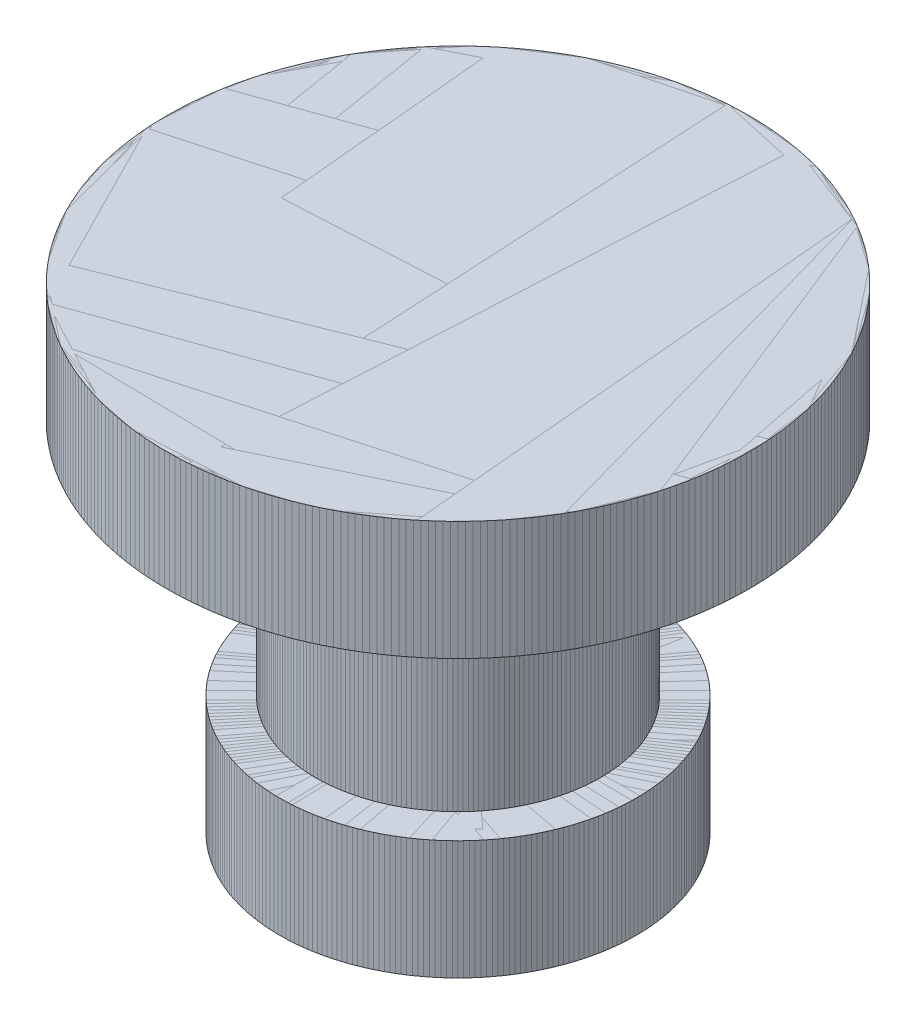
ISO-10303-21;
HEADER;
FILE_DESCRIPTION(('STEP AP214'),'2;1');
FILE_NAME('part.step','',(''),(''),'','','');
FILE_SCHEMA(('AUTOMOTIVE_DESIGN { 1 0 10303 214 1 1 1 1 }'));
ENDSEC;
DATA;
#1=APPLICATION_CONTEXT('core data for automotive mechanical design processes');
#2=APPLICATION_PROTOCOL_DEFINITION('international standard','automotive_design',2000,#1);
#3=PRODUCT_CONTEXT('',#1,'mechanical');
#4=PRODUCT('Part','Part','',(#3));
#5=PRODUCT_RELATED_PRODUCT_CATEGORY('part','',(#4));
#6=PRODUCT_DEFINITION_FORMATION('','',#4);
#7=PRODUCT_DEFINITION_CONTEXT('part definition',#1,'design');
#8=PRODUCT_DEFINITION('design','',#6,#7);
#9=PRODUCT_DEFINITION_SHAPE('','',#8);
#10=(LENGTH_UNIT() NAMED_UNIT(*) SI_UNIT(.MILLI.,.METRE.));
#11=(NAMED_UNIT(*) PLANE_ANGLE_UNIT() SI_UNIT($,.RADIAN.));
#12=(NAMED_UNIT(*) SI_UNIT($,.STERADIAN.) SOLID_ANGLE_UNIT());
#13=UNCERTAINTY_MEASURE_WITH_UNIT(LENGTH_MEASURE(1.E-05),#10,'distance_accuracy_value','');
#14=(GEOMETRIC_REPRESENTATION_CONTEXT(3) GLOBAL_UNCERTAINTY_ASSIGNED_CONTEXT((#13)) GLOBAL_UNIT_ASSIGNED_CONTEXT((#10,
#11,#12)) REPRESENTATION_CONTEXT('',''));
#15=CARTESIAN_POINT('',(0.,0.,0.));
#16=DIRECTION('',(0.,0.,1.));
#17=DIRECTION('',(1.,0.,0.));
#18=AXIS2_PLACEMENT_3D('',#15,#16,#17);
#19=CARTESIAN_POINT('',(0.,0.,0.));
#20=DIRECTION('',(0.,1.,0.));
#21=DIRECTION('',(1.,0.,0.));
#22=AXIS2_PLACEMENT_3D('',#19,#20,#21);
#23=PLANE('',#22);
#24=CARTESIAN_POINT('',(0.,0.,0.));
#25=DIRECTION('',(0.,-1.,0.));
#26=DIRECTION('',(-1.,0.,0.));
#27=AXIS2_PLACEMENT_3D('',#24,#25,#26);
#28=CIRCLE('',#27,6.223);
#29=CARTESIAN_POINT('',(-6.223,0.,0.));
#30=VERTEX_POINT('',#29);
#31=EDGE_CURVE('E11',#30,#30,#28,.T.);
#32=ORIENTED_EDGE('',*,*,#31,.F.);
#33=EDGE_LOOP('',(#32));
#34=FACE_BOUND('',#33,.T.);
#35=ADVANCED_FACE('F40',(#34),#23,.T.);
#36=CARTESIAN_POINT('',(0.,-10.16,0.));
#37=DIRECTION('',(0.,-1.,0.));
#38=DIRECTION('',(-1.,0.,0.));
#39=AXIS2_PLACEMENT_3D('',#36,#37,#38);
#40=CYLINDRICAL_SURFACE('',#39,6.223);
#41=ORIENTED_EDGE('',*,*,#31,.T.);
#42=EDGE_LOOP('',(#41));
#43=FACE_BOUND('',#42,.T.);
#44=CARTESIAN_POINT('',(0.,-2.54,0.));
#45=DIRECTION('',(0.,-1.,0.));
#46=DIRECTION('',(-1.,0.,0.));
#47=AXIS2_PLACEMENT_3D('',#44,#45,#46);
#48=CIRCLE('',#47,6.223);
#49=CARTESIAN_POINT('',(-6.223,-2.54,0.));
#50=VERTEX_POINT('',#49);
#51=EDGE_CURVE('E46',#50,#50,#48,.T.);
#52=ORIENTED_EDGE('',*,*,#51,.F.);
#53=EDGE_LOOP('',(#52));
#54=FACE_BOUND('',#53,.T.);
#55=ADVANCED_FACE('F82',(#43,#54),#40,.T.);
#56=CARTESIAN_POINT('',(0.,-2.54,-6.223));
#57=DIRECTION('',(0.,-1.,0.));
#58=DIRECTION('',(-1.,0.,0.));
#59=AXIS2_PLACEMENT_3D('',#56,#57,#58);
#60=PLANE('',#59);
#61=ORIENTED_EDGE('',*,*,#51,.T.);
#62=EDGE_LOOP('',(#61));
#63=FACE_BOUND('',#62,.T.);
#64=CARTESIAN_POINT('',(0.,-2.54,0.));
#65=DIRECTION('',(0.,-1.,0.));
#66=DIRECTION('',(-1.,0.,0.));
#67=AXIS2_PLACEMENT_3D('',#64,#65,#66);
#68=CIRCLE('',#67,3.048);
#69=CARTESIAN_POINT('',(-3.048,-2.54,0.));
#70=VERTEX_POINT('',#69);
#71=EDGE_CURVE('E50',#70,#70,#68,.T.);
#72=ORIENTED_EDGE('',*,*,#71,.F.);
#73=EDGE_LOOP('',(#72));
#74=FACE_BOUND('',#73,.T.);
#75=ADVANCED_FACE('F87',(#63,#74),#60,.T.);
#76=CARTESIAN_POINT('',(0.,-10.16,0.));
#77=DIRECTION('',(0.,-1.,0.));
#78=DIRECTION('',(-1.,0.,0.));
#79=AXIS2_PLACEMENT_3D('',#76,#77,#78);
#80=CYLINDRICAL_SURFACE('',#79,3.048);
#81=ORIENTED_EDGE('',*,*,#71,.T.);
#82=EDGE_LOOP('',(#81));
#83=FACE_BOUND('',#82,.T.);
#84=CARTESIAN_POINT('',(0.,-7.62,0.));
#85=DIRECTION('',(0.,-1.,0.));
#86=DIRECTION('',(-1.,0.,0.));
#87=AXIS2_PLACEMENT_3D('',#84,#85,#86);
#88=CIRCLE('',#87,3.048);
#89=CARTESIAN_POINT('',(-3.048,-7.62,0.));
#90=VERTEX_POINT('',#89);
#91=EDGE_CURVE('E54',#90,#90,#88,.T.);
#92=ORIENTED_EDGE('',*,*,#91,.F.);
#93=EDGE_LOOP('',(#92));
#94=FACE_BOUND('',#93,.T.);
#95=ADVANCED_FACE('F78',(#83,#94),#80,.T.);
#96=CARTESIAN_POINT('',(0.,-7.62,-3.048));
#97=DIRECTION('',(0.,1.,0.));
#98=DIRECTION('',(1.,0.,0.));
#99=AXIS2_PLACEMENT_3D('',#96,#97,#98);
#100=PLANE('',#99);
#101=ORIENTED_EDGE('',*,*,#91,.T.);
#102=EDGE_LOOP('',(#101));
#103=FACE_BOUND('',#102,.T.);
#104=CARTESIAN_POINT('',(0.,-7.62,0.));
#105=DIRECTION('',(0.,-1.,0.));
#106=DIRECTION('',(-1.,0.,0.));
#107=AXIS2_PLACEMENT_3D('',#104,#105,#106);
#108=CIRCLE('',#107,3.81);
#109=CARTESIAN_POINT('',(-3.81,-7.62,0.));
#110=VERTEX_POINT('',#109);
#111=EDGE_CURVE('E59',#110,#110,#108,.T.);
#112=ORIENTED_EDGE('',*,*,#111,.F.);
#113=EDGE_LOOP('',(#112));
#114=FACE_BOUND('',#113,.T.);
#115=ADVANCED_FACE('F70',(#103,#114),#100,.T.);
#116=CARTESIAN_POINT('',(0.,-10.16,0.));
#117=DIRECTION('',(0.,-1.,0.));
#118=DIRECTION('',(-1.,0.,0.));
#119=AXIS2_PLACEMENT_3D('',#116,#117,#118);
#120=CYLINDRICAL_SURFACE('',#119,3.81);
#121=ORIENTED_EDGE('',*,*,#111,.T.);
#122=EDGE_LOOP('',(#121));
#123=FACE_BOUND('',#122,.T.);
#124=CARTESIAN_POINT('',(0.,-10.16,0.));
#125=DIRECTION('',(0.,-1.,0.));
#126=DIRECTION('',(-1.,0.,0.));
#127=AXIS2_PLACEMENT_3D('',#124,#125,#126);
#128=CIRCLE('',#127,3.81);
#129=CARTESIAN_POINT('',(-3.81,-10.16,0.));
#130=VERTEX_POINT('',#129);
#131=EDGE_CURVE('E62',#130,#130,#128,.T.);
#132=ORIENTED_EDGE('',*,*,#131,.F.);
#133=EDGE_LOOP('',(#132));
#134=FACE_BOUND('',#133,.T.);
#135=ADVANCED_FACE('F68',(#123,#134),#120,.T.);
#136=CARTESIAN_POINT('',(0.,-10.16,-3.81));
#137=DIRECTION('',(0.,-1.,0.));
#138=DIRECTION('',(-1.,0.,0.));
#139=AXIS2_PLACEMENT_3D('',#136,#137,#138);
#140=PLANE('',#139);
#141=ORIENTED_EDGE('',*,*,#131,.T.);
#142=EDGE_LOOP('',(#141));
#143=FACE_BOUND('',#142,.T.);
#144=ADVANCED_FACE('F66',(#143),#140,.T.);
#145=CLOSED_SHELL('',(#35,#55,#75,#95,#115,#135,#144));
#146=MANIFOLD_SOLID_BREP('B2',#145);
#147=CARTESIAN_POINT('',(0.,0.,0.));
#148=DIRECTION('',(0.,1.,0.));
#149=DIRECTION('',(0.,0.,-1.));
#150=AXIS2_PLACEMENT_3D('',#147,#148,#149);
#151=PLANE('',#150);
#152=CARTESIAN_POINT('',(0.,0.,0.));
#153=DIRECTION('',(0.,-1.,0.));
#154=DIRECTION('',(0.,0.,1.));
#155=AXIS2_PLACEMENT_3D('',#152,#153,#154);
#156=CIRCLE('',#155,6.223);
#157=CARTESIAN_POINT('',(0.,0.,6.223));
#158=VERTEX_POINT('',#157);
#159=EDGE_CURVE('E39',#158,#158,#156,.T.);
#160=ORIENTED_EDGE('',*,*,#159,.F.);
#161=EDGE_LOOP('',(#160));
#162=FACE_BOUND('',#161,.T.);
#163=ADVANCED_FACE('F149',(#162),#151,.T.);
#164=CARTESIAN_POINT('',(0.,-10.16,0.));
#165=DIRECTION('',(0.,-1.,0.));
#166=DIRECTION('',(0.,0.,1.));
#167=AXIS2_PLACEMENT_3D('',#164,#165,#166);
#168=CYLINDRICAL_SURFACE('',#167,6.223);
#169=ORIENTED_EDGE('',*,*,#159,.T.);
#170=EDGE_LOOP('',(#169));
#171=FACE_BOUND('',#170,.T.);
#172=CARTESIAN_POINT('',(0.,-2.54,0.));
#173=DIRECTION('',(0.,-1.,0.));
#174=DIRECTION('',(0.,0.,1.));
#175=AXIS2_PLACEMENT_3D('',#172,#173,#174);
#176=CIRCLE('',#175,6.223);
#177=CARTESIAN_POINT('',(0.,-2.54,6.223));
#178=VERTEX_POINT('',#177);
#179=EDGE_CURVE('E155',#178,#178,#176,.T.);
#180=ORIENTED_EDGE('',*,*,#179,.F.);
#181=EDGE_LOOP('',(#180));
#182=FACE_BOUND('',#181,.T.);
#183=ADVANCED_FACE('F191',(#171,#182),#168,.T.);
#184=CARTESIAN_POINT('',(-6.223,-2.54,0.));
#185=DIRECTION('',(0.,-1.,0.));
#186=DIRECTION('',(0.,0.,1.));
#187=AXIS2_PLACEMENT_3D('',#184,#185,#186);
#188=PLANE('',#187);
#189=ORIENTED_EDGE('',*,*,#179,.T.);
#190=EDGE_LOOP('',(#189));
#191=FACE_BOUND('',#190,.T.);
#192=CARTESIAN_POINT('',(0.,-2.54,0.));
#193=DIRECTION('',(0.,-1.,0.));
#194=DIRECTION('',(0.,0.,1.));
#195=AXIS2_PLACEMENT_3D('',#192,#193,#194);
#196=CIRCLE('',#195,3.048);
#197=CARTESIAN_POINT('',(0.,-2.54,3.048));
#198=VERTEX_POINT('',#197);
#199=EDGE_CURVE('E159',#198,#198,#196,.T.);
#200=ORIENTED_EDGE('',*,*,#199,.F.);
#201=EDGE_LOOP('',(#200));
#202=FACE_BOUND('',#201,.T.);
#203=ADVANCED_FACE('F196',(#191,#202),#188,.T.);
#204=CARTESIAN_POINT('',(0.,-10.16,0.));
#205=DIRECTION('',(0.,-1.,0.));
#206=DIRECTION('',(0.,0.,1.));
#207=AXIS2_PLACEMENT_3D('',#204,#205,#206);
#208=CYLINDRICAL_SURFACE('',#207,3.048);
#209=ORIENTED_EDGE('',*,*,#199,.T.);
#210=EDGE_LOOP('',(#209));
#211=FACE_BOUND('',#210,.T.);
#212=CARTESIAN_POINT('',(0.,-7.62,0.));
#213=DIRECTION('',(0.,-1.,0.));
#214=DIRECTION('',(0.,0.,1.));
#215=AXIS2_PLACEMENT_3D('',#212,#213,#214);
#216=CIRCLE('',#215,3.048);
#217=CARTESIAN_POINT('',(0.,-7.62,3.048));
#218=VERTEX_POINT('',#217);
#219=EDGE_CURVE('E163',#218,#218,#216,.T.);
#220=ORIENTED_EDGE('',*,*,#219,.F.);
#221=EDGE_LOOP('',(#220));
#222=FACE_BOUND('',#221,.T.);
#223=ADVANCED_FACE('F187',(#211,#222),#208,.T.);
#224=CARTESIAN_POINT('',(-3.048,-7.62,0.));
#225=DIRECTION('',(0.,1.,0.));
#226=DIRECTION('',(0.,0.,-1.));
#227=AXIS2_PLACEMENT_3D('',#224,#225,#226);
#228=PLANE('',#227);
#229=ORIENTED_EDGE('',*,*,#219,.T.);
#230=EDGE_LOOP('',(#229));
#231=FACE_BOUND('',#230,.T.);
#232=CARTESIAN_POINT('',(0.,-7.62,0.));
#233=DIRECTION('',(0.,-1.,0.));
#234=DIRECTION('',(0.,0.,1.));
#235=AXIS2_PLACEMENT_3D('',#232,#233,#234);
#236=CIRCLE('',#235,3.81);
#237=CARTESIAN_POINT('',(0.,-7.62,3.81));
#238=VERTEX_POINT('',#237);
#239=EDGE_CURVE('E168',#238,#238,#236,.T.);
#240=ORIENTED_EDGE('',*,*,#239,.F.);
#241=EDGE_LOOP('',(#240));
#242=FACE_BOUND('',#241,.T.);
#243=ADVANCED_FACE('F179',(#231,#242),#228,.T.);
#244=CARTESIAN_POINT('',(0.,-10.16,0.));
#245=DIRECTION('',(0.,-1.,0.));
#246=DIRECTION('',(0.,0.,1.));
#247=AXIS2_PLACEMENT_3D('',#244,#245,#246);
#248=CYLINDRICAL_SURFACE('',#247,3.81);
#249=ORIENTED_EDGE('',*,*,#239,.T.);
#250=EDGE_LOOP('',(#249));
#251=FACE_BOUND('',#250,.T.);
#252=CARTESIAN_POINT('',(0.,-10.16,0.));
#253=DIRECTION('',(0.,-1.,0.));
#254=DIRECTION('',(0.,0.,1.));
#255=AXIS2_PLACEMENT_3D('',#252,#253,#254);
#256=CIRCLE('',#255,3.81);
#257=CARTESIAN_POINT('',(0.,-10.16,3.81));
#258=VERTEX_POINT('',#257);
#259=EDGE_CURVE('E171',#258,#258,#256,.T.);
#260=ORIENTED_EDGE('',*,*,#259,.F.);
#261=EDGE_LOOP('',(#260));
#262=FACE_BOUND('',#261,.T.);
#263=ADVANCED_FACE('F177',(#251,#262),#248,.T.);
#264=CARTESIAN_POINT('',(-3.81,-10.16,0.));
#265=DIRECTION('',(0.,-1.,0.));
#266=DIRECTION('',(0.,0.,1.));
#267=AXIS2_PLACEMENT_3D('',#264,#265,#266);
#268=PLANE('',#267);
#269=ORIENTED_EDGE('',*,*,#259,.T.);
#270=EDGE_LOOP('',(#269));
#271=FACE_BOUND('',#270,.T.);
#272=ADVANCED_FACE('F175',(#271),#268,.T.);
#273=CLOSED_SHELL('',(#163,#183,#203,#223,#243,#263,#272));
#274=MANIFOLD_SOLID_BREP('B6',#273);
#275=CARTESIAN_POINT('',(0.,0.,0.));
#276=DIRECTION('',(0.,1.,0.));
#277=DIRECTION('',(-1.,0.,0.));
#278=AXIS2_PLACEMENT_3D('',#275,#276,#277);
#279=PLANE('',#278);
#280=CARTESIAN_POINT('',(0.,0.,0.));
#281=DIRECTION('',(0.,-1.,0.));
#282=DIRECTION('',(1.,0.,0.));
#283=AXIS2_PLACEMENT_3D('',#280,#281,#282);
#284=CIRCLE('',#283,6.223);
#285=CARTESIAN_POINT('',(6.223,0.,0.));
#286=VERTEX_POINT('',#285);
#287=EDGE_CURVE('E148',#286,#286,#284,.T.);
#288=ORIENTED_EDGE('',*,*,#287,.F.);
#289=EDGE_LOOP('',(#288));
#290=FACE_BOUND('',#289,.T.);
#291=ADVANCED_FACE('F257',(#290),#279,.T.);
#292=CARTESIAN_POINT('',(0.,-10.16,0.));
#293=DIRECTION('',(0.,-1.,0.));
#294=DIRECTION('',(1.,0.,0.));
#295=AXIS2_PLACEMENT_3D('',#292,#293,#294);
#296=CYLINDRICAL_SURFACE('',#295,6.223);
#297=ORIENTED_EDGE('',*,*,#287,.T.);
#298=EDGE_LOOP('',(#297));
#299=FACE_BOUND('',#298,.T.);
#300=CARTESIAN_POINT('',(0.,-2.54,0.));
#301=DIRECTION('',(0.,-1.,0.));
#302=DIRECTION('',(1.,0.,0.));
#303=AXIS2_PLACEMENT_3D('',#300,#301,#302);
#304=CIRCLE('',#303,6.223);
#305=CARTESIAN_POINT('',(6.223,-2.54,0.));
#306=VERTEX_POINT('',#305);
#307=EDGE_CURVE('E263',#306,#306,#304,.T.);
#308=ORIENTED_EDGE('',*,*,#307,.F.);
#309=EDGE_LOOP('',(#308));
#310=FACE_BOUND('',#309,.T.);
#311=ADVANCED_FACE('F299',(#299,#310),#296,.T.);
#312=CARTESIAN_POINT('',(0.,-2.54,6.223));
#313=DIRECTION('',(0.,-1.,0.));
#314=DIRECTION('',(1.,0.,0.));
#315=AXIS2_PLACEMENT_3D('',#312,#313,#314);
#316=PLANE('',#315);
#317=ORIENTED_EDGE('',*,*,#307,.T.);
#318=EDGE_LOOP('',(#317));
#319=FACE_BOUND('',#318,.T.);
#320=CARTESIAN_POINT('',(0.,-2.54,0.));
#321=DIRECTION('',(0.,-1.,0.));
#322=DIRECTION('',(1.,0.,0.));
#323=AXIS2_PLACEMENT_3D('',#320,#321,#322);
#324=CIRCLE('',#323,3.048);
#325=CARTESIAN_POINT('',(3.048,-2.54,0.));
#326=VERTEX_POINT('',#325);
#327=EDGE_CURVE('E267',#326,#326,#324,.T.);
#328=ORIENTED_EDGE('',*,*,#327,.F.);
#329=EDGE_LOOP('',(#328));
#330=FACE_BOUND('',#329,.T.);
#331=ADVANCED_FACE('F304',(#319,#330),#316,.T.);
#332=CARTESIAN_POINT('',(0.,-10.16,0.));
#333=DIRECTION('',(0.,-1.,0.));
#334=DIRECTION('',(1.,0.,0.));
#335=AXIS2_PLACEMENT_3D('',#332,#333,#334);
#336=CYLINDRICAL_SURFACE('',#335,3.048);
#337=ORIENTED_EDGE('',*,*,#327,.T.);
#338=EDGE_LOOP('',(#337));
#339=FACE_BOUND('',#338,.T.);
#340=CARTESIAN_POINT('',(0.,-7.62,0.));
#341=DIRECTION('',(0.,-1.,0.));
#342=DIRECTION('',(1.,0.,0.));
#343=AXIS2_PLACEMENT_3D('',#340,#341,#342);
#344=CIRCLE('',#343,3.048);
#345=CARTESIAN_POINT('',(3.048,-7.62,0.));
#346=VERTEX_POINT('',#345);
#347=EDGE_CURVE('E271',#346,#346,#344,.T.);
#348=ORIENTED_EDGE('',*,*,#347,.F.);
#349=EDGE_LOOP('',(#348));
#350=FACE_BOUND('',#349,.T.);
#351=ADVANCED_FACE('F295',(#339,#350),#336,.T.);
#352=CARTESIAN_POINT('',(0.,-7.62,3.048));
#353=DIRECTION('',(0.,1.,0.));
#354=DIRECTION('',(-1.,0.,0.));
#355=AXIS2_PLACEMENT_3D('',#352,#353,#354);
#356=PLANE('',#355);
#357=ORIENTED_EDGE('',*,*,#347,.T.);
#358=EDGE_LOOP('',(#357));
#359=FACE_BOUND('',#358,.T.);
#360=CARTESIAN_POINT('',(0.,-7.62,0.));
#361=DIRECTION('',(0.,-1.,0.));
#362=DIRECTION('',(1.,0.,0.));
#363=AXIS2_PLACEMENT_3D('',#360,#361,#362);
#364=CIRCLE('',#363,3.81);
#365=CARTESIAN_POINT('',(3.81,-7.62,0.));
#366=VERTEX_POINT('',#365);
#367=EDGE_CURVE('E276',#366,#366,#364,.T.);
#368=ORIENTED_EDGE('',*,*,#367,.F.);
#369=EDGE_LOOP('',(#368));
#370=FACE_BOUND('',#369,.T.);
#371=ADVANCED_FACE('F287',(#359,#370),#356,.T.);
#372=CARTESIAN_POINT('',(0.,-10.16,0.));
#373=DIRECTION('',(0.,-1.,0.));
#374=DIRECTION('',(1.,0.,0.));
#375=AXIS2_PLACEMENT_3D('',#372,#373,#374);
#376=CYLINDRICAL_SURFACE('',#375,3.81);
#377=ORIENTED_EDGE('',*,*,#367,.T.);
#378=EDGE_LOOP('',(#377));
#379=FACE_BOUND('',#378,.T.);
#380=CARTESIAN_POINT('',(0.,-10.16,0.));
#381=DIRECTION('',(0.,-1.,0.));
#382=DIRECTION('',(1.,0.,0.));
#383=AXIS2_PLACEMENT_3D('',#380,#381,#382);
#384=CIRCLE('',#383,3.81);
#385=CARTESIAN_POINT('',(3.81,-10.16,0.));
#386=VERTEX_POINT('',#385);
#387=EDGE_CURVE('E279',#386,#386,#384,.T.);
#388=ORIENTED_EDGE('',*,*,#387,.F.);
#389=EDGE_LOOP('',(#388));
#390=FACE_BOUND('',#389,.T.);
#391=ADVANCED_FACE('F285',(#379,#390),#376,.T.);
#392=CARTESIAN_POINT('',(0.,-10.16,3.81));
#393=DIRECTION('',(0.,-1.,0.));
#394=DIRECTION('',(1.,0.,0.));
#395=AXIS2_PLACEMENT_3D('',#392,#393,#394);
#396=PLANE('',#395);
#397=ORIENTED_EDGE('',*,*,#387,.T.);
#398=EDGE_LOOP('',(#397));
#399=FACE_BOUND('',#398,.T.);
#400=ADVANCED_FACE('F283',(#399),#396,.T.);
#401=CLOSED_SHELL('',(#291,#311,#331,#351,#371,#391,#400));
#402=MANIFOLD_SOLID_BREP('B34',#401);
#403=CARTESIAN_POINT('',(0.,0.,0.));
#404=DIRECTION('',(0.,1.,0.));
#405=DIRECTION('',(0.,0.,1.));
#406=AXIS2_PLACEMENT_3D('',#403,#404,#405);
#407=PLANE('',#406);
#408=CARTESIAN_POINT('',(0.,0.,0.));
#409=DIRECTION('',(0.,-1.,0.));
#410=DIRECTION('',(0.,0.,-1.));
#411=AXIS2_PLACEMENT_3D('',#408,#409,#410);
#412=CIRCLE('',#411,6.223);
#413=CARTESIAN_POINT('',(0.,0.,-6.223));
#414=VERTEX_POINT('',#413);
#415=EDGE_CURVE('E256',#414,#414,#412,.T.);
#416=ORIENTED_EDGE('',*,*,#415,.F.);
#417=EDGE_LOOP('',(#416));
#418=FACE_BOUND('',#417,.T.);
#419=ADVANCED_FACE('F358',(#418),#407,.T.);
#420=CARTESIAN_POINT('',(0.,-10.16,0.));
#421=DIRECTION('',(0.,-1.,0.));
#422=DIRECTION('',(0.,0.,-1.));
#423=AXIS2_PLACEMENT_3D('',#420,#421,#422);
#424=CYLINDRICAL_SURFACE('',#423,6.223);
#425=ORIENTED_EDGE('',*,*,#415,.T.);
#426=EDGE_LOOP('',(#425));
#427=FACE_BOUND('',#426,.T.);
#428=CARTESIAN_POINT('',(0.,-2.54,0.));
#429=DIRECTION('',(0.,-1.,0.));
#430=DIRECTION('',(0.,0.,-1.));
#431=AXIS2_PLACEMENT_3D('',#428,#429,#430);
#432=CIRCLE('',#431,6.223);
#433=CARTESIAN_POINT('',(0.,-2.54,-6.223));
#434=VERTEX_POINT('',#433);
#435=EDGE_CURVE('E364',#434,#434,#432,.T.);
#436=ORIENTED_EDGE('',*,*,#435,.F.);
#437=EDGE_LOOP('',(#436));
#438=FACE_BOUND('',#437,.T.);
#439=ADVANCED_FACE('F400',(#427,#438),#424,.T.);
#440=CARTESIAN_POINT('',(6.223,-2.54,0.));
#441=DIRECTION('',(0.,-1.,0.));
#442=DIRECTION('',(0.,0.,-1.));
#443=AXIS2_PLACEMENT_3D('',#440,#441,#442);
#444=PLANE('',#443);
#445=ORIENTED_EDGE('',*,*,#435,.T.);
#446=EDGE_LOOP('',(#445));
#447=FACE_BOUND('',#446,.T.);
#448=CARTESIAN_POINT('',(0.,-2.54,0.));
#449=DIRECTION('',(0.,-1.,0.));
#450=DIRECTION('',(0.,0.,-1.));
#451=AXIS2_PLACEMENT_3D('',#448,#449,#450);
#452=CIRCLE('',#451,3.048);
#453=CARTESIAN_POINT('',(0.,-2.54,-3.048));
#454=VERTEX_POINT('',#453);
#455=EDGE_CURVE('E368',#454,#454,#452,.T.);
#456=ORIENTED_EDGE('',*,*,#455,.F.);
#457=EDGE_LOOP('',(#456));
#458=FACE_BOUND('',#457,.T.);
#459=ADVANCED_FACE('F405',(#447,#458),#444,.T.);
#460=CARTESIAN_POINT('',(0.,-10.16,0.));
#461=DIRECTION('',(0.,-1.,0.));
#462=DIRECTION('',(0.,0.,-1.));
#463=AXIS2_PLACEMENT_3D('',#460,#461,#462);
#464=CYLINDRICAL_SURFACE('',#463,3.048);
#465=ORIENTED_EDGE('',*,*,#455,.T.);
#466=EDGE_LOOP('',(#465));
#467=FACE_BOUND('',#466,.T.);
#468=CARTESIAN_POINT('',(0.,-7.62,0.));
#469=DIRECTION('',(0.,-1.,0.));
#470=DIRECTION('',(0.,0.,-1.));
#471=AXIS2_PLACEMENT_3D('',#468,#469,#470);
#472=CIRCLE('',#471,3.048);
#473=CARTESIAN_POINT('',(0.,-7.62,-3.048));
#474=VERTEX_POINT('',#473);
#475=EDGE_CURVE('E372',#474,#474,#472,.T.);
#476=ORIENTED_EDGE('',*,*,#475,.F.);
#477=EDGE_LOOP('',(#476));
#478=FACE_BOUND('',#477,.T.);
#479=ADVANCED_FACE('F396',(#467,#478),#464,.T.);
#480=CARTESIAN_POINT('',(3.048,-7.62,0.));
#481=DIRECTION('',(0.,1.,0.));
#482=DIRECTION('',(0.,0.,1.));
#483=AXIS2_PLACEMENT_3D('',#480,#481,#482);
#484=PLANE('',#483);
#485=ORIENTED_EDGE('',*,*,#475,.T.);
#486=EDGE_LOOP('',(#485));
#487=FACE_BOUND('',#486,.T.);
#488=CARTESIAN_POINT('',(0.,-7.62,0.));
#489=DIRECTION('',(0.,-1.,0.));
#490=DIRECTION('',(0.,0.,-1.));
#491=AXIS2_PLACEMENT_3D('',#488,#489,#490);
#492=CIRCLE('',#491,3.81);
#493=CARTESIAN_POINT('',(0.,-7.62,-3.81));
#494=VERTEX_POINT('',#493);
#495=EDGE_CURVE('E377',#494,#494,#492,.T.);
#496=ORIENTED_EDGE('',*,*,#495,.F.);
#497=EDGE_LOOP('',(#496));
#498=FACE_BOUND('',#497,.T.);
#499=ADVANCED_FACE('F388',(#487,#498),#484,.T.);
#500=CARTESIAN_POINT('',(0.,-10.16,0.));
#501=DIRECTION('',(0.,-1.,0.));
#502=DIRECTION('',(0.,0.,-1.));
#503=AXIS2_PLACEMENT_3D('',#500,#501,#502);
#504=CYLINDRICAL_SURFACE('',#503,3.81);
#505=ORIENTED_EDGE('',*,*,#495,.T.);
#506=EDGE_LOOP('',(#505));
#507=FACE_BOUND('',#506,.T.);
#508=CARTESIAN_POINT('',(0.,-10.16,0.));
#509=DIRECTION('',(0.,-1.,0.));
#510=DIRECTION('',(0.,0.,-1.));
#511=AXIS2_PLACEMENT_3D('',#508,#509,#510);
#512=CIRCLE('',#511,3.81);
#513=CARTESIAN_POINT('',(0.,-10.16,-3.81));
#514=VERTEX_POINT('',#513);
#515=EDGE_CURVE('E380',#514,#514,#512,.T.);
#516=ORIENTED_EDGE('',*,*,#515,.F.);
#517=EDGE_LOOP('',(#516));
#518=FACE_BOUND('',#517,.T.);
#519=ADVANCED_FACE('F386',(#507,#518),#504,.T.);
#520=CARTESIAN_POINT('',(3.81,-10.16,0.));
#521=DIRECTION('',(0.,-1.,0.));
#522=DIRECTION('',(0.,0.,-1.));
#523=AXIS2_PLACEMENT_3D('',#520,#521,#522);
#524=PLANE('',#523);
#525=ORIENTED_EDGE('',*,*,#515,.T.);
#526=EDGE_LOOP('',(#525));
#527=FACE_BOUND('',#526,.T.);
#528=ADVANCED_FACE('F384',(#527),#524,.T.);
#529=CLOSED_SHELL('',(#419,#439,#459,#479,#499,#519,#528));
#530=MANIFOLD_SOLID_BREP('B143',#529);
#531=ADVANCED_BREP_SHAPE_REPRESENTATION('',(#18,#146,#274,#402,#530),#14);
#532=SHAPE_DEFINITION_REPRESENTATION(#9,#531);
ENDSEC;
END-ISO-10303-21;
